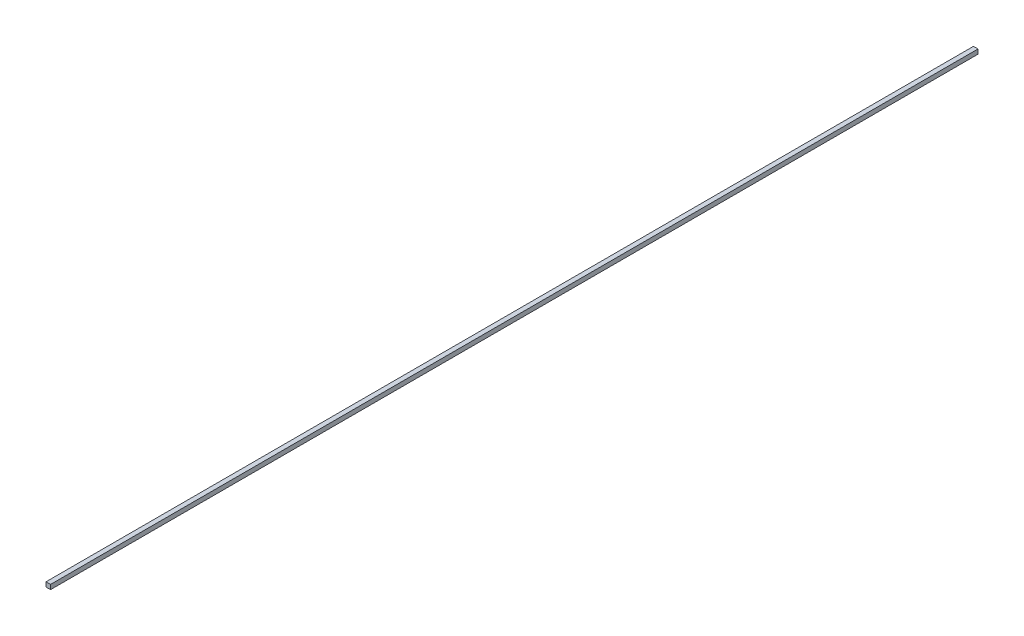
ISO-10303-21;
HEADER;
FILE_DESCRIPTION(('STEP AP214'),'2;1');
FILE_NAME('part.step','',(''),(''),'','','');
FILE_SCHEMA(('AUTOMOTIVE_DESIGN { 1 0 10303 214 1 1 1 1 }'));
ENDSEC;
DATA;
#1=APPLICATION_CONTEXT('core data for automotive mechanical design processes');
#2=APPLICATION_PROTOCOL_DEFINITION('international standard','automotive_design',2000,#1);
#3=PRODUCT_CONTEXT('',#1,'mechanical');
#4=PRODUCT('Part','Part','',(#3));
#5=PRODUCT_RELATED_PRODUCT_CATEGORY('part','',(#4));
#6=PRODUCT_DEFINITION_FORMATION('','',#4);
#7=PRODUCT_DEFINITION_CONTEXT('part definition',#1,'design');
#8=PRODUCT_DEFINITION('design','',#6,#7);
#9=PRODUCT_DEFINITION_SHAPE('','',#8);
#10=(LENGTH_UNIT() NAMED_UNIT(*) SI_UNIT(.MILLI.,.METRE.));
#11=(NAMED_UNIT(*) PLANE_ANGLE_UNIT() SI_UNIT($,.RADIAN.));
#12=(NAMED_UNIT(*) SI_UNIT($,.STERADIAN.) SOLID_ANGLE_UNIT());
#13=UNCERTAINTY_MEASURE_WITH_UNIT(LENGTH_MEASURE(1.E-05),#10,'distance_accuracy_value','');
#14=(GEOMETRIC_REPRESENTATION_CONTEXT(3) GLOBAL_UNCERTAINTY_ASSIGNED_CONTEXT((#13)) GLOBAL_UNIT_ASSIGNED_CONTEXT((#10,
#11,#12)) REPRESENTATION_CONTEXT('',''));
#15=CARTESIAN_POINT('',(0.,0.,0.));
#16=DIRECTION('',(0.,0.,1.));
#17=DIRECTION('',(1.,0.,0.));
#18=AXIS2_PLACEMENT_3D('',#15,#16,#17);
#19=CARTESIAN_POINT('',(-4.5,4.5,916.874));
#20=DIRECTION('',(0.,-1.,0.));
#21=DIRECTION('',(1.,0.,0.));
#22=AXIS2_PLACEMENT_3D('',#19,#20,#21);
#23=PLANE('',#22);
#24=DIRECTION('',(0.,0.,-1.));
#25=VECTOR('',#24,1.);
#26=CARTESIAN_POINT('',(4.5,4.5,916.874));
#27=LINE('',#26,#25);
#28=CARTESIAN_POINT('',(4.5,4.5,916.874));
#29=VERTEX_POINT('',#28);
#30=CARTESIAN_POINT('',(4.5,4.5,-916.874));
#31=VERTEX_POINT('',#30);
#32=EDGE_CURVE('E89',#29,#31,#27,.T.);
#33=ORIENTED_EDGE('',*,*,#32,.T.);
#34=DIRECTION('',(-1.,0.,0.));
#35=VECTOR('',#34,1.);
#36=CARTESIAN_POINT('',(-4.5,4.5,-916.874));
#37=LINE('',#36,#35);
#38=CARTESIAN_POINT('',(-4.5,4.5,-916.874));
#39=VERTEX_POINT('',#38);
#40=EDGE_CURVE('E85',#31,#39,#37,.T.);
#41=ORIENTED_EDGE('',*,*,#40,.T.);
#42=DIRECTION('',(0.,0.,-1.));
#43=VECTOR('',#42,1.);
#44=CARTESIAN_POINT('',(-4.5,4.5,916.874));
#45=LINE('',#44,#43);
#46=CARTESIAN_POINT('',(-4.5,4.5,916.874));
#47=VERTEX_POINT('',#46);
#48=EDGE_CURVE('E11',#47,#39,#45,.T.);
#49=ORIENTED_EDGE('',*,*,#48,.F.);
#50=DIRECTION('',(-1.,0.,0.));
#51=VECTOR('',#50,1.);
#52=CARTESIAN_POINT('',(-4.5,4.5,916.874));
#53=LINE('',#52,#51);
#54=EDGE_CURVE('E96',#29,#47,#53,.T.);
#55=ORIENTED_EDGE('',*,*,#54,.F.);
#56=EDGE_LOOP('',(#33,#41,#49,#55));
#57=FACE_BOUND('',#56,.T.);
#58=ADVANCED_FACE('F33',(#57),#23,.F.);
#59=CARTESIAN_POINT('',(-4.5,-4.5,916.874));
#60=DIRECTION('',(1.,0.,0.));
#61=DIRECTION('',(0.,0.,-1.));
#62=AXIS2_PLACEMENT_3D('',#59,#60,#61);
#63=PLANE('',#62);
#64=ORIENTED_EDGE('',*,*,#48,.T.);
#65=DIRECTION('',(0.,-1.,0.));
#66=VECTOR('',#65,1.);
#67=CARTESIAN_POINT('',(-4.5,-4.5,-916.874));
#68=LINE('',#67,#66);
#69=CARTESIAN_POINT('',(-4.5,-4.5,-916.874));
#70=VERTEX_POINT('',#69);
#71=EDGE_CURVE('E75',#39,#70,#68,.T.);
#72=ORIENTED_EDGE('',*,*,#71,.T.);
#73=DIRECTION('',(0.,0.,-1.));
#74=VECTOR('',#73,1.);
#75=CARTESIAN_POINT('',(-4.5,-4.5,916.874));
#76=LINE('',#75,#74);
#77=CARTESIAN_POINT('',(-4.5,-4.5,916.874));
#78=VERTEX_POINT('',#77);
#79=EDGE_CURVE('E40',#78,#70,#76,.T.);
#80=ORIENTED_EDGE('',*,*,#79,.F.);
#81=DIRECTION('',(0.,-1.,0.));
#82=VECTOR('',#81,1.);
#83=CARTESIAN_POINT('',(-4.5,-4.5,916.874));
#84=LINE('',#83,#82);
#85=EDGE_CURVE('E76',#47,#78,#84,.T.);
#86=ORIENTED_EDGE('',*,*,#85,.F.);
#87=EDGE_LOOP('',(#64,#72,#80,#86));
#88=FACE_BOUND('',#87,.T.);
#89=ADVANCED_FACE('F73',(#88),#63,.F.);
#90=CARTESIAN_POINT('',(-4.5,-4.5,916.874));
#91=DIRECTION('',(0.,1.,0.));
#92=DIRECTION('',(-1.,0.,0.));
#93=AXIS2_PLACEMENT_3D('',#90,#91,#92);
#94=PLANE('',#93);
#95=ORIENTED_EDGE('',*,*,#79,.T.);
#96=DIRECTION('',(1.,0.,0.));
#97=VECTOR('',#96,1.);
#98=CARTESIAN_POINT('',(-4.5,-4.5,-916.874));
#99=LINE('',#98,#97);
#100=CARTESIAN_POINT('',(4.5,-4.5,-916.874));
#101=VERTEX_POINT('',#100);
#102=EDGE_CURVE('E87',#70,#101,#99,.T.);
#103=ORIENTED_EDGE('',*,*,#102,.T.);
#104=DIRECTION('',(0.,0.,-1.));
#105=VECTOR('',#104,1.);
#106=CARTESIAN_POINT('',(4.5,-4.5,916.874));
#107=LINE('',#106,#105);
#108=CARTESIAN_POINT('',(4.5,-4.5,916.874));
#109=VERTEX_POINT('',#108);
#110=EDGE_CURVE('E102',#109,#101,#107,.T.);
#111=ORIENTED_EDGE('',*,*,#110,.F.);
#112=DIRECTION('',(1.,0.,0.));
#113=VECTOR('',#112,1.);
#114=CARTESIAN_POINT('',(-4.5,-4.5,916.874));
#115=LINE('',#114,#113);
#116=EDGE_CURVE('E52',#78,#109,#115,.T.);
#117=ORIENTED_EDGE('',*,*,#116,.F.);
#118=EDGE_LOOP('',(#95,#103,#111,#117));
#119=FACE_BOUND('',#118,.T.);
#120=ADVANCED_FACE('F104',(#119),#94,.F.);
#121=CARTESIAN_POINT('',(4.5,-4.5,916.874));
#122=DIRECTION('',(-1.,0.,0.));
#123=DIRECTION('',(0.,0.,1.));
#124=AXIS2_PLACEMENT_3D('',#121,#122,#123);
#125=PLANE('',#124);
#126=ORIENTED_EDGE('',*,*,#110,.T.);
#127=DIRECTION('',(0.,1.,0.));
#128=VECTOR('',#127,1.);
#129=CARTESIAN_POINT('',(4.5,-4.5,-916.874));
#130=LINE('',#129,#128);
#131=EDGE_CURVE('E94',#101,#31,#130,.T.);
#132=ORIENTED_EDGE('',*,*,#131,.T.);
#133=ORIENTED_EDGE('',*,*,#32,.F.);
#134=DIRECTION('',(0.,1.,0.));
#135=VECTOR('',#134,1.);
#136=CARTESIAN_POINT('',(4.5,-4.5,916.874));
#137=LINE('',#136,#135);
#138=EDGE_CURVE('E47',#109,#29,#137,.T.);
#139=ORIENTED_EDGE('',*,*,#138,.F.);
#140=EDGE_LOOP('',(#126,#132,#133,#139));
#141=FACE_BOUND('',#140,.T.);
#142=ADVANCED_FACE('F106',(#141),#125,.F.);
#143=CARTESIAN_POINT('',(0.,0.,916.874));
#144=DIRECTION('',(0.,0.,1.));
#145=DIRECTION('',(1.,0.,0.));
#146=AXIS2_PLACEMENT_3D('',#143,#144,#145);
#147=PLANE('',#146);
#148=ORIENTED_EDGE('',*,*,#54,.T.);
#149=ORIENTED_EDGE('',*,*,#85,.T.);
#150=ORIENTED_EDGE('',*,*,#116,.T.);
#151=ORIENTED_EDGE('',*,*,#138,.T.);
#152=EDGE_LOOP('',(#148,#149,#150,#151));
#153=FACE_BOUND('',#152,.T.);
#154=ADVANCED_FACE('F107',(#153),#147,.T.);
#155=CARTESIAN_POINT('',(0.,0.,-916.874));
#156=DIRECTION('',(0.,0.,-1.));
#157=DIRECTION('',(1.,0.,0.));
#158=AXIS2_PLACEMENT_3D('',#155,#156,#157);
#159=PLANE('',#158);
#160=ORIENTED_EDGE('',*,*,#40,.F.);
#161=ORIENTED_EDGE('',*,*,#131,.F.);
#162=ORIENTED_EDGE('',*,*,#102,.F.);
#163=ORIENTED_EDGE('',*,*,#71,.F.);
#164=EDGE_LOOP('',(#160,#161,#162,#163));
#165=FACE_BOUND('',#164,.T.);
#166=ADVANCED_FACE('F83',(#165),#159,.T.);
#167=CLOSED_SHELL('',(#58,#89,#120,#142,#154,#166));
#168=MANIFOLD_SOLID_BREP('B2',#167);
#169=ADVANCED_BREP_SHAPE_REPRESENTATION('',(#18,#168),#14);
#170=SHAPE_DEFINITION_REPRESENTATION(#9,#169);
ENDSEC;
END-ISO-10303-21;
